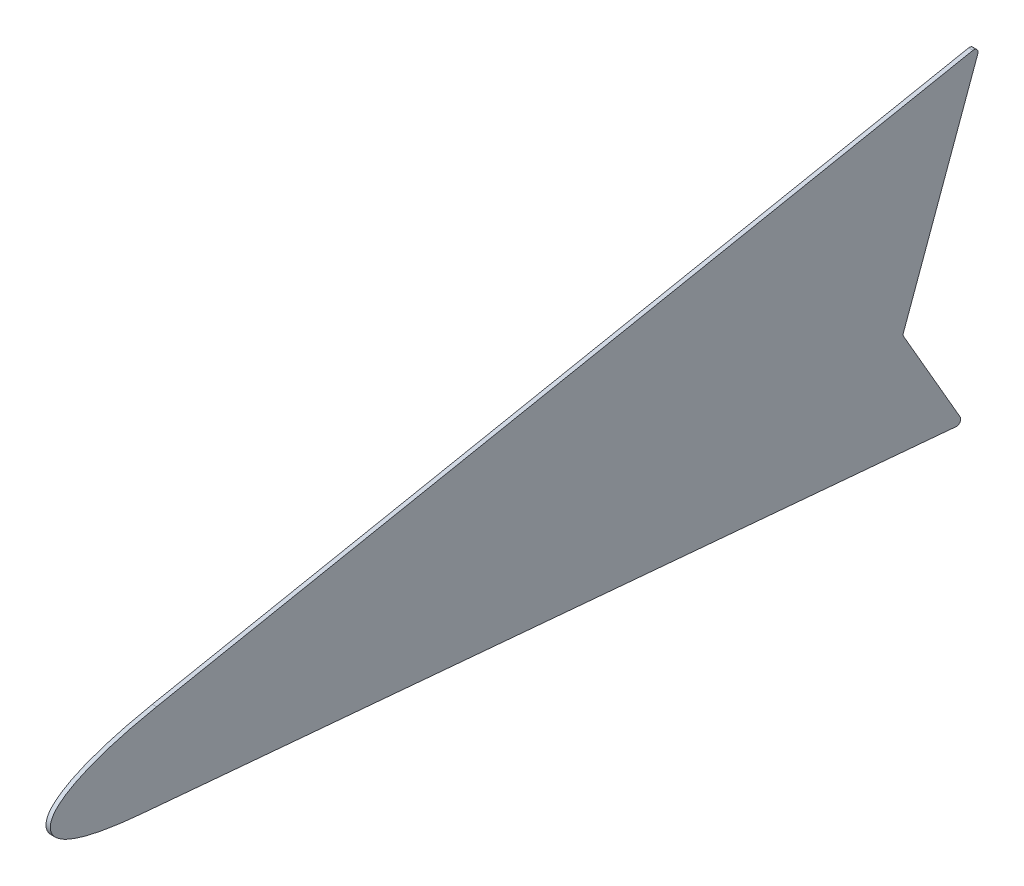
ISO-10303-21;
HEADER;
FILE_DESCRIPTION(('STEP AP214'),'2;1');
FILE_NAME('part.step','',(''),(''),'','','');
FILE_SCHEMA(('AUTOMOTIVE_DESIGN { 1 0 10303 214 1 1 1 1 }'));
ENDSEC;
DATA;
#1=APPLICATION_CONTEXT('core data for automotive mechanical design processes');
#2=APPLICATION_PROTOCOL_DEFINITION('international standard','automotive_design',2000,#1);
#3=PRODUCT_CONTEXT('',#1,'mechanical');
#4=PRODUCT('Part','Part','',(#3));
#5=PRODUCT_RELATED_PRODUCT_CATEGORY('part','',(#4));
#6=PRODUCT_DEFINITION_FORMATION('','',#4);
#7=PRODUCT_DEFINITION_CONTEXT('part definition',#1,'design');
#8=PRODUCT_DEFINITION('design','',#6,#7);
#9=PRODUCT_DEFINITION_SHAPE('','',#8);
#10=(LENGTH_UNIT() NAMED_UNIT(*) SI_UNIT(.MILLI.,.METRE.));
#11=(NAMED_UNIT(*) PLANE_ANGLE_UNIT() SI_UNIT($,.RADIAN.));
#12=(NAMED_UNIT(*) SI_UNIT($,.STERADIAN.) SOLID_ANGLE_UNIT());
#13=UNCERTAINTY_MEASURE_WITH_UNIT(LENGTH_MEASURE(1.E-05),#10,'distance_accuracy_value','');
#14=(GEOMETRIC_REPRESENTATION_CONTEXT(3) GLOBAL_UNCERTAINTY_ASSIGNED_CONTEXT((#13)) GLOBAL_UNIT_ASSIGNED_CONTEXT((#10,
#11,#12)) REPRESENTATION_CONTEXT('',''));
#15=CARTESIAN_POINT('',(0.,0.,0.));
#16=DIRECTION('',(0.,0.,1.));
#17=DIRECTION('',(1.,0.,0.));
#18=AXIS2_PLACEMENT_3D('',#15,#16,#17);
#19=CARTESIAN_POINT('',(2.,0.,-400.));
#20=CARTESIAN_POINT('',(2.,0.0197947129168696,-400.001279740819));
#21=CARTESIAN_POINT('',(2.,0.156332527137393,-399.125755392038));
#22=CARTESIAN_POINT('',(2.,0.393382640647567,-398.229457276693));
#23=CARTESIAN_POINT('',(2.,0.829825186715881,-396.022017359462));
#24=CARTESIAN_POINT('',(2.,1.41285046403746,-393.278844343855));
#25=CARTESIAN_POINT('',(2.,2.15806264658598,-389.636096258546));
#26=CARTESIAN_POINT('',(2.,3.04633621741629,-385.26126028557));
#27=CARTESIAN_POINT('',(2.,4.07101521641602,-380.11450057359));
#28=CARTESIAN_POINT('',(2.,5.21845014752439,-374.235554989704));
#29=CARTESIAN_POINT('',(2.,6.47588854331504,-367.640871489683));
#30=CARTESIAN_POINT('',(2.,7.82896610656693,-360.358344019565));
#31=CARTESIAN_POINT('',(2.,9.26211326073045,-352.415962034534));
#32=CARTESIAN_POINT('',(2.,10.7617204287628,-343.84576304999));
#33=CARTESIAN_POINT('',(2.,12.3093900978254,-334.681319033717));
#34=CARTESIAN_POINT('',(2.,13.8923181987624,-324.959756502571));
#35=CARTESIAN_POINT('',(2.,15.4920665589494,-314.719411881119));
#36=CARTESIAN_POINT('',(2.,17.0949943472313,-304.002041698686));
#37=CARTESIAN_POINT('',(2.,18.6830735471429,-292.850622554109));
#38=CARTESIAN_POINT('',(2.,20.2429413774078,-281.310854388592));
#39=CARTESIAN_POINT('',(2.,21.757434649034,-269.429406110183));
#40=CARTESIAN_POINT('',(2.,23.2131814732132,-257.254945982873));
#41=CARTESIAN_POINT('',(2.,24.5932386059916,-244.837355317981));
#42=CARTESIAN_POINT('',(2.,25.8853586046403,-232.227860986267));
#43=CARTESIAN_POINT('',(2.,27.0727890487436,-219.47859088263));
#44=CARTESIAN_POINT('',(2.,28.1440143029068,-206.642452070231));
#45=CARTESIAN_POINT('',(2.,29.0838708339412,-193.772737074317));
#46=CARTESIAN_POINT('',(2.,29.8810597647019,-180.923115762722));
#47=CARTESIAN_POINT('',(2.,30.5231575214927,-168.135515730387));
#48=CARTESIAN_POINT('',(2.,31.0074692117424,-155.442056785022));
#49=CARTESIAN_POINT('',(2.,31.2633627796288,-142.89430668028));
#50=CARTESIAN_POINT('',(2.,31.285978209756,-130.559397193334));
#51=CARTESIAN_POINT('',(2.,31.0738400012975,-118.51284837154));
#52=CARTESIAN_POINT('',(2.,30.627749201524,-106.807852799432));
#53=CARTESIAN_POINT('',(2.,29.9511551801664,-95.4960260814104));
#54=CARTESIAN_POINT('',(2.,29.0516922510891,-84.627170622608));
#55=CARTESIAN_POINT('',(2.,27.9389758199482,-74.2489762635761));
#56=CARTESIAN_POINT('',(2.,26.6254718148516,-64.4067193232036));
#57=CARTESIAN_POINT('',(2.,25.1266591699938,-55.1428756137543));
#58=CARTESIAN_POINT('',(2.,23.459629101011,-46.4971036079525));
#59=CARTESIAN_POINT('',(2.,21.6429047407353,-38.50579772216));
#60=CARTESIAN_POINT('',(2.,19.6983176474782,-31.2014663634208));
#61=CARTESIAN_POINT('',(2.,17.6459947650302,-24.6136995122795));
#62=CARTESIAN_POINT('',(2.,15.5081505371571,-18.7672416395236));
#63=CARTESIAN_POINT('',(2.,13.3047006786554,-13.6835504005457));
#64=CARTESIAN_POINT('',(2.,11.0558168216952,-9.37800281993501));
#65=CARTESIAN_POINT('',(2.,8.77722888373101,-5.86129791716867));
#66=CARTESIAN_POINT('',(2.,6.47719945193535,-3.13832299701485));
#67=CARTESIAN_POINT('',(2.,4.15223168769162,-1.21012998654755));
#68=CARTESIAN_POINT('',(2.,1.77293844222192,-0.0978117570210915));
#69=CARTESIAN_POINT('',(2.,-0.636761689370791,0.114930504650288));
#70=CARTESIAN_POINT('',(2.,-2.95314326207808,-0.577664339869116));
#71=CARTESIAN_POINT('',(2.,-5.06106832091674,-2.13584835524254));
#72=CARTESIAN_POINT('',(2.,-6.95971381874842,-4.46944507192717));
#73=CARTESIAN_POINT('',(2.,-8.6867559259926,-7.56004092316311));
#74=CARTESIAN_POINT('',(2.,-10.2560623998425,-11.4019440674076));
#75=CARTESIAN_POINT('',(2.,-11.6711394018962,-15.9860321124689));
#76=CARTESIAN_POINT('',(2.,-12.9302584233227,-21.29697145114));
#77=CARTESIAN_POINT('',(2.,-14.0326276613934,-27.3142769348645));
#78=CARTESIAN_POINT('',(2.,-14.9762511589987,-34.0140341239877));
#79=CARTESIAN_POINT('',(2.,-15.7633313970272,-41.3686012689998));
#80=CARTESIAN_POINT('',(2.,-16.3932440315434,-49.3487634440007));
#81=CARTESIAN_POINT('',(2.,-16.8720198371499,-57.9222696969542));
#82=CARTESIAN_POINT('',(2.,-17.2029368860178,-67.0555379420581));
#83=CARTESIAN_POINT('',(2.,-17.3943932629078,-76.7129338688125));
#84=CARTESIAN_POINT('',(2.,-17.4542992160825,-86.8570209128186));
#85=CARTESIAN_POINT('',(2.,-17.3945996061524,-97.4490934261169));
#86=CARTESIAN_POINT('',(2.,-17.2262929887119,-108.448584203136));
#87=CARTESIAN_POINT('',(2.,-16.9625043068118,-119.813954734919));
#88=CARTESIAN_POINT('',(2.,-16.6186558833316,-131.501979375258));
#89=CARTESIAN_POINT('',(2.,-16.2084429411847,-143.468294931642));
#90=CARTESIAN_POINT('',(2.,-15.7469400754044,-155.688824280291));
#91=CARTESIAN_POINT('',(2.,-15.2497610206306,-168.128434028804));
#92=CARTESIAN_POINT('',(2.,-14.6691266753124,-180.735619486172));
#93=CARTESIAN_POINT('',(2.,-14.0250470986317,-193.438321948107));
#94=CARTESIAN_POINT('',(2.,-13.3295952782398,-206.173468480363));
#95=CARTESIAN_POINT('',(2.,-12.593926451913,-218.88946064599));
#96=CARTESIAN_POINT('',(2.,-11.82935805124,-231.534918207502));
#97=CARTESIAN_POINT('',(2.,-11.0443185590819,-244.058176462787));
#98=CARTESIAN_POINT('',(2.,-10.2493391434955,-256.40829648734));
#99=CARTESIAN_POINT('',(2.,-9.45156771535331,-268.534442570928));
#100=CARTESIAN_POINT('',(2.,-8.65797581301992,-280.386904846025));
#101=CARTESIAN_POINT('',(2.,-7.8744821114451,-291.916612523528));
#102=CARTESIAN_POINT('',(2.,-7.10704796262947,-303.075883872231));
#103=CARTESIAN_POINT('',(2.,-6.35970304914345,-313.818139647621));
#104=CARTESIAN_POINT('',(2.,-5.63722878534559,-324.098630784116));
#105=CARTESIAN_POINT('',(2.,-4.94327642531218,-333.874155684626));
#106=CARTESIAN_POINT('',(2.,-4.28056144658677,-343.103593810719));
#107=CARTESIAN_POINT('',(2.,-3.65384008946951,-351.747956433842));
#108=CARTESIAN_POINT('',(2.,-3.06594327333352,-359.770598015047));
#109=CARTESIAN_POINT('',(2.,-2.52021412782374,-367.137192908518));
#110=CARTESIAN_POINT('',(2.,-2.01979637012181,-373.816934016911));
#111=CARTESIAN_POINT('',(2.,-1.56843461662025,-379.779057308665));
#112=CARTESIAN_POINT('',(2.,-1.1694943704302,-385.004444182564));
#113=CARTESIAN_POINT('',(2.,-0.825264554324244,-389.450573968433));
#114=CARTESIAN_POINT('',(2.,-0.541831640047924,-393.155293389024));
#115=CARTESIAN_POINT('',(2.,-0.310810179319602,-395.949030842327));
#116=CARTESIAN_POINT('',(2.,-0.161082139924569,-398.193673160703));
#117=CARTESIAN_POINT('',(2.,-0.0415201994549506,-399.113015792472));
#118=CARTESIAN_POINT('',(2.,-0.0197982912369602,-399.99872002784));
#119=CARTESIAN_POINT('',(2.,0.,-400.));
#120=B_SPLINE_CURVE_WITH_KNOTS('',3,(#19,#20,#21,#22,#23,#24,#25,#26,#27,#28,#29,#30,#31,#32,
#33,#34,#35,#36,#37,#38,#39,#40,#41,#42,#43,#44,#45,#46,#47,#48,#49,#50,#51,#52,#53,#54,#55,#56,
#57,#58,#59,#60,#61,#62,#63,#64,#65,#66,#67,#68,#69,#70,#71,#72,#73,#74,#75,#76,#77,#78,#79,#80,
#81,#82,#83,#84,#85,#86,#87,#88,#89,#90,#91,#92,#93,#94,#95,#96,#97,#98,#99,#100,#101,#102,#103,
#104,#105,#106,#107,#108,#109,#110,#111,#112,#113,#114,#115,#116,#117,#118,#119),.UNSPECIFIED.,
.T.,.F.,(4,1,1,1,1,1,1,1,1,1,1,1,1,1,1,1,1,1,1,1,1,1,1,1,1,1,1,1,1,1,1,1,1,1,1,1,1,1,1,1,1,1,1,
1,1,1,1,1,1,1,1,1,1,1,1,1,1,1,1,1,1,1,1,1,1,1,1,1,1,1,1,1,1,1,1,1,1,1,1,1,1,1,1,1,1,1,1,1,1,1,1,
1,1,1,1,1,1,1,4),(0.,0.000509380845012488,0.00203646307590124,0.00457341926629267,
0.0081105145788543,0.0126329096148001,0.0181209836253684,0.0245525666897466,0.0318997827868983,
0.0401327208195902,0.0492169538926517,0.0591146106234487,0.0697846469598171,0.0811828204928815,
0.093262058015785,0.105972599321169,0.119262722082758,0.133076198552495,0.147356830406351,
0.162045952365196,0.177082357202397,0.192404911433952,0.207949512805986,0.223652623225201,
0.239448770732334,0.255273659445434,0.271062013813257,0.286748998460011,0.302314538635537,
0.317730991933122,0.332857313309961,0.347631370311637,0.361994884224481,0.375890433346041,
0.389262766611196,0.402060741464395,0.414235274400511,0.425740249634603,0.436534667690425,
0.44658026405841,0.455844073318529,0.464299075737223,0.471923139377412,0.478704818330874,
0.484641939507213,0.489750398382793,0.49407133019376,0.497690549223108,0.500769140893951,
0.503574039001313,0.506378403433147,0.509454074703249,0.513061791383556,0.517355790229092,
0.522417511888073,0.528283213816907,0.534965478772509,0.542459995104075,0.550751382375855,
0.559818254563727,0.569631416818408,0.580159206451264,0.591364742786932,0.603207990153797,
0.615646879320324,0.628634573778994,0.642124006572728,0.656064092669976,0.670402751194665,
0.685085102221196,0.70005497449661,0.715333927532613,0.730825550855942,0.746423602741533,
0.7620644973333,0.77768509909477,0.793221223582033,0.808609709294583,0.823786827886597,
0.83869043554114,0.853258431078044,0.867431208122838,0.881149184071695,0.894355313168835,
0.906994501715906,0.919013675859722,0.930361749946572,0.94099147817621,0.950857148257383,
0.959916467609207,0.968131539835627,0.975466385138065,0.981888965553268,0.987372125664153,
0.991891224075229,0.995426990907306,0.997964024036548,0.999490527073444,1.),.UNSPECIFIED.);
#121=DIRECTION('',(-1.,0.,0.));
#122=VECTOR('',#121,1.);
#123=SURFACE_OF_LINEAR_EXTRUSION('',#120,#122);
#124=CARTESIAN_POINT('',(0.,0.,-400.));
#125=CARTESIAN_POINT('',(0.,0.0197947129168696,-400.001279740819));
#126=CARTESIAN_POINT('',(0.,0.156332527137393,-399.125755392038));
#127=CARTESIAN_POINT('',(0.,0.393382640647567,-398.229457276693));
#128=CARTESIAN_POINT('',(0.,0.829825186715881,-396.022017359462));
#129=CARTESIAN_POINT('',(0.,1.41285046403746,-393.278844343855));
#130=CARTESIAN_POINT('',(0.,2.15806264658598,-389.636096258546));
#131=CARTESIAN_POINT('',(0.,3.04633621741629,-385.26126028557));
#132=CARTESIAN_POINT('',(0.,4.07101521641602,-380.11450057359));
#133=CARTESIAN_POINT('',(0.,5.21845014752439,-374.235554989704));
#134=CARTESIAN_POINT('',(0.,6.47588854331504,-367.640871489683));
#135=CARTESIAN_POINT('',(0.,7.82896610656693,-360.358344019565));
#136=CARTESIAN_POINT('',(0.,9.26211326073045,-352.415962034534));
#137=CARTESIAN_POINT('',(0.,10.7617204287628,-343.84576304999));
#138=CARTESIAN_POINT('',(0.,12.3093900978254,-334.681319033717));
#139=CARTESIAN_POINT('',(0.,13.8923181987624,-324.959756502571));
#140=CARTESIAN_POINT('',(0.,15.4920665589494,-314.719411881119));
#141=CARTESIAN_POINT('',(0.,17.0949943472313,-304.002041698686));
#142=CARTESIAN_POINT('',(0.,18.6830735471429,-292.850622554109));
#143=CARTESIAN_POINT('',(0.,20.2429413774078,-281.310854388592));
#144=CARTESIAN_POINT('',(0.,21.757434649034,-269.429406110183));
#145=CARTESIAN_POINT('',(0.,23.2131814732132,-257.254945982873));
#146=CARTESIAN_POINT('',(0.,24.5932386059916,-244.837355317981));
#147=CARTESIAN_POINT('',(0.,25.8853586046403,-232.227860986267));
#148=CARTESIAN_POINT('',(0.,27.0727890487436,-219.47859088263));
#149=CARTESIAN_POINT('',(0.,28.1440143029068,-206.642452070231));
#150=CARTESIAN_POINT('',(0.,29.0838708339412,-193.772737074317));
#151=CARTESIAN_POINT('',(0.,29.8810597647019,-180.923115762722));
#152=CARTESIAN_POINT('',(0.,30.5231575214927,-168.135515730387));
#153=CARTESIAN_POINT('',(0.,31.0074692117424,-155.442056785022));
#154=CARTESIAN_POINT('',(0.,31.2633627796288,-142.89430668028));
#155=CARTESIAN_POINT('',(0.,31.285978209756,-130.559397193334));
#156=CARTESIAN_POINT('',(0.,31.0738400012975,-118.51284837154));
#157=CARTESIAN_POINT('',(0.,30.627749201524,-106.807852799432));
#158=CARTESIAN_POINT('',(0.,29.9511551801664,-95.4960260814104));
#159=CARTESIAN_POINT('',(0.,29.0516922510891,-84.627170622608));
#160=CARTESIAN_POINT('',(0.,27.9389758199482,-74.2489762635761));
#161=CARTESIAN_POINT('',(0.,26.6254718148516,-64.4067193232036));
#162=CARTESIAN_POINT('',(0.,25.1266591699938,-55.1428756137543));
#163=CARTESIAN_POINT('',(0.,23.459629101011,-46.4971036079525));
#164=CARTESIAN_POINT('',(0.,21.6429047407353,-38.50579772216));
#165=CARTESIAN_POINT('',(0.,19.6983176474782,-31.2014663634208));
#166=CARTESIAN_POINT('',(0.,17.6459947650302,-24.6136995122795));
#167=CARTESIAN_POINT('',(0.,15.5081505371571,-18.7672416395236));
#168=CARTESIAN_POINT('',(0.,13.3047006786554,-13.6835504005457));
#169=CARTESIAN_POINT('',(0.,11.0558168216952,-9.37800281993501));
#170=CARTESIAN_POINT('',(0.,8.77722888373101,-5.86129791716867));
#171=CARTESIAN_POINT('',(0.,6.47719945193535,-3.13832299701485));
#172=CARTESIAN_POINT('',(0.,4.15223168769162,-1.21012998654755));
#173=CARTESIAN_POINT('',(0.,1.77293844222192,-0.0978117570210915));
#174=CARTESIAN_POINT('',(0.,-0.636761689370791,0.114930504650288));
#175=CARTESIAN_POINT('',(0.,-2.95314326207808,-0.577664339869116));
#176=CARTESIAN_POINT('',(0.,-5.06106832091674,-2.13584835524254));
#177=CARTESIAN_POINT('',(0.,-6.95971381874842,-4.46944507192717));
#178=CARTESIAN_POINT('',(0.,-8.6867559259926,-7.56004092316311));
#179=CARTESIAN_POINT('',(0.,-10.2560623998425,-11.4019440674076));
#180=CARTESIAN_POINT('',(0.,-11.6711394018962,-15.9860321124689));
#181=CARTESIAN_POINT('',(0.,-12.9302584233227,-21.29697145114));
#182=CARTESIAN_POINT('',(0.,-14.0326276613934,-27.3142769348645));
#183=CARTESIAN_POINT('',(0.,-14.9762511589987,-34.0140341239877));
#184=CARTESIAN_POINT('',(0.,-15.7633313970272,-41.3686012689998));
#185=CARTESIAN_POINT('',(0.,-16.3932440315434,-49.3487634440007));
#186=CARTESIAN_POINT('',(0.,-16.8720198371499,-57.9222696969542));
#187=CARTESIAN_POINT('',(0.,-17.2029368860178,-67.0555379420581));
#188=CARTESIAN_POINT('',(0.,-17.3943932629078,-76.7129338688125));
#189=CARTESIAN_POINT('',(0.,-17.4542992160825,-86.8570209128186));
#190=CARTESIAN_POINT('',(0.,-17.3945996061524,-97.4490934261169));
#191=CARTESIAN_POINT('',(0.,-17.2262929887119,-108.448584203136));
#192=CARTESIAN_POINT('',(0.,-16.9625043068118,-119.813954734919));
#193=CARTESIAN_POINT('',(0.,-16.6186558833316,-131.501979375258));
#194=CARTESIAN_POINT('',(0.,-16.2084429411847,-143.468294931642));
#195=CARTESIAN_POINT('',(0.,-15.7469400754044,-155.688824280291));
#196=CARTESIAN_POINT('',(0.,-15.2497610206306,-168.128434028804));
#197=CARTESIAN_POINT('',(0.,-14.6691266753124,-180.735619486172));
#198=CARTESIAN_POINT('',(0.,-14.0250470986317,-193.438321948107));
#199=CARTESIAN_POINT('',(0.,-13.3295952782398,-206.173468480363));
#200=CARTESIAN_POINT('',(0.,-12.593926451913,-218.88946064599));
#201=CARTESIAN_POINT('',(0.,-11.82935805124,-231.534918207502));
#202=CARTESIAN_POINT('',(0.,-11.0443185590819,-244.058176462787));
#203=CARTESIAN_POINT('',(0.,-10.2493391434955,-256.40829648734));
#204=CARTESIAN_POINT('',(0.,-9.45156771535331,-268.534442570928));
#205=CARTESIAN_POINT('',(0.,-8.65797581301992,-280.386904846025));
#206=CARTESIAN_POINT('',(0.,-7.8744821114451,-291.916612523528));
#207=CARTESIAN_POINT('',(0.,-7.10704796262947,-303.075883872231));
#208=CARTESIAN_POINT('',(0.,-6.35970304914345,-313.818139647621));
#209=CARTESIAN_POINT('',(0.,-5.63722878534559,-324.098630784116));
#210=CARTESIAN_POINT('',(0.,-4.94327642531218,-333.874155684626));
#211=CARTESIAN_POINT('',(0.,-4.28056144658677,-343.103593810719));
#212=CARTESIAN_POINT('',(0.,-3.65384008946951,-351.747956433842));
#213=CARTESIAN_POINT('',(0.,-3.06594327333352,-359.770598015047));
#214=CARTESIAN_POINT('',(0.,-2.52021412782374,-367.137192908518));
#215=CARTESIAN_POINT('',(0.,-2.01979637012181,-373.816934016911));
#216=CARTESIAN_POINT('',(0.,-1.56843461662025,-379.779057308665));
#217=CARTESIAN_POINT('',(0.,-1.1694943704302,-385.004444182564));
#218=CARTESIAN_POINT('',(0.,-0.825264554324244,-389.450573968433));
#219=CARTESIAN_POINT('',(0.,-0.541831640047924,-393.155293389024));
#220=CARTESIAN_POINT('',(0.,-0.310810179319602,-395.949030842327));
#221=CARTESIAN_POINT('',(0.,-0.161082139924569,-398.193673160703));
#222=CARTESIAN_POINT('',(0.,-0.0415201994549506,-399.113015792472));
#223=CARTESIAN_POINT('',(0.,-0.0197982912369602,-399.99872002784));
#224=CARTESIAN_POINT('',(0.,0.,-400.));
#225=B_SPLINE_CURVE_WITH_KNOTS('',3,(#124,#125,#126,#127,#128,#129,#130,#131,#132,#133,#134,
#135,#136,#137,#138,#139,#140,#141,#142,#143,#144,#145,#146,#147,#148,#149,#150,#151,#152,#153,
#154,#155,#156,#157,#158,#159,#160,#161,#162,#163,#164,#165,#166,#167,#168,#169,#170,#171,#172,
#173,#174,#175,#176,#177,#178,#179,#180,#181,#182,#183,#184,#185,#186,#187,#188,#189,#190,#191,
#192,#193,#194,#195,#196,#197,#198,#199,#200,#201,#202,#203,#204,#205,#206,#207,#208,#209,#210,
#211,#212,#213,#214,#215,#216,#217,#218,#219,#220,#221,#222,#223,#224),.UNSPECIFIED.,.T.,.F.,(4,
1,1,1,1,1,1,1,1,1,1,1,1,1,1,1,1,1,1,1,1,1,1,1,1,1,1,1,1,1,1,1,1,1,1,1,1,1,1,1,1,1,1,1,1,1,1,1,1,
1,1,1,1,1,1,1,1,1,1,1,1,1,1,1,1,1,1,1,1,1,1,1,1,1,1,1,1,1,1,1,1,1,1,1,1,1,1,1,1,1,1,1,1,1,1,1,1,
1,4),(0.,0.000509380845012488,0.00203646307590124,0.00457341926629267,0.0081105145788543,
0.0126329096148001,0.0181209836253684,0.0245525666897466,0.0318997827868983,0.0401327208195902,
0.0492169538926517,0.0591146106234487,0.0697846469598171,0.0811828204928815,0.093262058015785,
0.105972599321169,0.119262722082758,0.133076198552495,0.147356830406351,0.162045952365196,
0.177082357202397,0.192404911433952,0.207949512805986,0.223652623225201,0.239448770732334,
0.255273659445434,0.271062013813257,0.286748998460011,0.302314538635537,0.317730991933122,
0.332857313309961,0.347631370311637,0.361994884224481,0.375890433346041,0.389262766611196,
0.402060741464395,0.414235274400511,0.425740249634603,0.436534667690425,0.44658026405841,
0.455844073318529,0.464299075737223,0.471923139377412,0.478704818330874,0.484641939507213,
0.489750398382793,0.49407133019376,0.497690549223108,0.500769140893951,0.503574039001313,
0.506378403433147,0.509454074703249,0.513061791383556,0.517355790229092,0.522417511888073,
0.528283213816907,0.534965478772509,0.542459995104075,0.550751382375855,0.559818254563727,
0.569631416818408,0.580159206451264,0.591364742786932,0.603207990153797,0.615646879320324,
0.628634573778994,0.642124006572728,0.656064092669976,0.670402751194665,0.685085102221196,
0.70005497449661,0.715333927532613,0.730825550855942,0.746423602741533,0.7620644973333,
0.77768509909477,0.793221223582033,0.808609709294583,0.823786827886597,0.83869043554114,
0.853258431078044,0.867431208122838,0.881149184071695,0.894355313168835,0.906994501715906,
0.919013675859722,0.930361749946572,0.94099147817621,0.950857148257383,0.959916467609207,
0.968131539835627,0.975466385138065,0.981888965553268,0.987372125664153,0.991891224075229,
0.995426990907306,0.997964024036548,0.999490527073444,1.),.UNSPECIFIED.);
#226=CARTESIAN_POINT('',(0.,24.0968066538449,-49.8714391729704));
#227=VERTEX_POINT('',#226);
#228=CARTESIAN_POINT('',(0.,-15.8377600076667,-42.5868399173375));
#229=VERTEX_POINT('',#228);
#230=EDGE_CURVE('E122',#227,#229,#225,.T.);
#231=ORIENTED_EDGE('',*,*,#230,.T.);
#232=DIRECTION('',(-1.,0.,0.));
#233=VECTOR('',#232,1.);
#234=CARTESIAN_POINT('',(2.,-15.8377600076667,-42.5868399173375));
#235=LINE('',#234,#233);
#236=CARTESIAN_POINT('',(2.,-15.8377600076667,-42.5868399173375));
#237=VERTEX_POINT('',#236);
#238=EDGE_CURVE('E107',#237,#229,#235,.T.);
#239=ORIENTED_EDGE('',*,*,#238,.F.);
#240=CARTESIAN_POINT('',(2.,24.0968066538449,-49.8714391729704));
#241=VERTEX_POINT('',#240);
#242=EDGE_CURVE('E111',#241,#237,#120,.T.);
#243=ORIENTED_EDGE('',*,*,#242,.F.);
#244=DIRECTION('',(-1.,0.,0.));
#245=VECTOR('',#244,1.);
#246=CARTESIAN_POINT('',(2.,24.0968066538449,-49.8714391729704));
#247=LINE('',#246,#245);
#248=EDGE_CURVE('E124',#241,#227,#247,.T.);
#249=ORIENTED_EDGE('',*,*,#248,.T.);
#250=EDGE_LOOP('',(#231,#239,#243,#249));
#251=FACE_BOUND('',#250,.T.);
#252=ADVANCED_FACE('F39',(#251),#123,.F.);
#253=CARTESIAN_POINT('',(2.,-15.8377600076667,-42.5868399173375));
#254=DIRECTION('',(0.,0.996112072083883,-0.0880950614322601));
#255=DIRECTION('',(0.,0.0880950614322601,0.996112072083883));
#256=AXIS2_PLACEMENT_3D('',#253,#254,#255);
#257=PLANE('',#256);
#258=DIRECTION('',(0.,-0.0880950614322601,-0.996112072083883));
#259=VECTOR('',#258,1.);
#260=CARTESIAN_POINT('',(0.,-15.8377600076667,-42.5868399173375));
#261=LINE('',#260,#259);
#262=CARTESIAN_POINT('',(0.,-49.6611519625234,-425.036077108286));
#263=VERTEX_POINT('',#262);
#264=EDGE_CURVE('E164',#229,#263,#261,.T.);
#265=ORIENTED_EDGE('',*,*,#264,.T.);
#266=DIRECTION('',(-1.,0.,0.));
#267=VECTOR('',#266,1.);
#268=CARTESIAN_POINT('',(2.,-49.6611519625234,-425.036077108286));
#269=LINE('',#268,#267);
#270=CARTESIAN_POINT('',(2.,-49.6611519625234,-425.036077108286));
#271=VERTEX_POINT('',#270);
#272=EDGE_CURVE('E62',#263,#271,#269,.F.);
#273=ORIENTED_EDGE('',*,*,#272,.T.);
#274=DIRECTION('',(0.,-0.0880950614322601,-0.996112072083883));
#275=VECTOR('',#274,1.);
#276=CARTESIAN_POINT('',(2.,-15.8377600076667,-42.5868399173375));
#277=LINE('',#276,#275);
#278=EDGE_CURVE('E103',#237,#271,#277,.T.);
#279=ORIENTED_EDGE('',*,*,#278,.F.);
#280=ORIENTED_EDGE('',*,*,#238,.T.);
#281=EDGE_LOOP('',(#265,#273,#279,#280));
#282=FACE_BOUND('',#281,.T.);
#283=ADVANCED_FACE('F105',(#282),#257,.F.);
#284=CARTESIAN_POINT('',(2.,-50.,-428.867513459482));
#285=DIRECTION('',(0.,-0.500000000000004,0.866025403784436));
#286=DIRECTION('',(0.,-0.866025403784437,-0.500000000000004));
#287=AXIS2_PLACEMENT_3D('',#284,#285,#286);
#288=PLANE('',#287);
#289=DIRECTION('',(0.,0.866025403784436,0.500000000000004));
#290=VECTOR('',#289,1.);
#291=CARTESIAN_POINT('',(0.,-50.,-428.867513459482));
#292=LINE('',#291,#290);
#293=CARTESIAN_POINT('',(0.,-46.6689278183556,-426.944318038719));
#294=VERTEX_POINT('',#293);
#295=CARTESIAN_POINT('',(0.,-0.807668555882955,-400.466307658155));
#296=VERTEX_POINT('',#295);
#297=EDGE_CURVE('E153',#294,#296,#292,.T.);
#298=ORIENTED_EDGE('',*,*,#297,.T.);
#299=DIRECTION('',(-1.,0.,0.));
#300=VECTOR('',#299,1.);
#301=CARTESIAN_POINT('',(2.,-0.807668555882945,-400.466307658155));
#302=LINE('',#301,#300);
#303=CARTESIAN_POINT('',(2.,-0.807668555882955,-400.466307658155));
#304=VERTEX_POINT('',#303);
#305=EDGE_CURVE('E136',#296,#304,#302,.F.);
#306=ORIENTED_EDGE('',*,*,#305,.T.);
#307=DIRECTION('',(0.,0.866025403784436,0.500000000000004));
#308=VECTOR('',#307,1.);
#309=CARTESIAN_POINT('',(2.,-50.,-428.867513459482));
#310=LINE('',#309,#308);
#311=CARTESIAN_POINT('',(2.,-46.6689278183556,-426.944318038719));
#312=VERTEX_POINT('',#311);
#313=EDGE_CURVE('E110',#312,#304,#310,.T.);
#314=ORIENTED_EDGE('',*,*,#313,.F.);
#315=DIRECTION('',(-1.,0.,0.));
#316=VECTOR('',#315,1.);
#317=CARTESIAN_POINT('',(2.,-46.6689278183556,-426.944318038719));
#318=LINE('',#317,#316);
#319=EDGE_CURVE('E133',#312,#294,#318,.T.);
#320=ORIENTED_EDGE('',*,*,#319,.T.);
#321=EDGE_LOOP('',(#298,#306,#314,#320));
#322=FACE_BOUND('',#321,.T.);
#323=ADVANCED_FACE('F160',(#322),#288,.F.);
#324=CARTESIAN_POINT('',(2.,100.,-436.397023426621));
#325=DIRECTION('',(0.,0.342020143325673,0.939692620785907));
#326=DIRECTION('',(0.,-0.939692620785907,0.342020143325673));
#327=AXIS2_PLACEMENT_3D('',#324,#325,#326);
#328=PLANE('',#327);
#329=DIRECTION('',(0.,0.939692620785907,-0.342020143325673));
#330=VECTOR('',#329,1.);
#331=CARTESIAN_POINT('',(2.,100.,-436.397023426621));
#332=LINE('',#331,#330);
#333=CARTESIAN_POINT('',(2.,0.876371730768433,-400.318973224152));
#334=VERTEX_POINT('',#333);
#335=CARTESIAN_POINT('',(2.,96.6707467585685,-435.185274344405));
#336=VERTEX_POINT('',#335);
#337=EDGE_CURVE('E169',#334,#336,#332,.T.);
#338=ORIENTED_EDGE('',*,*,#337,.F.);
#339=DIRECTION('',(-1.,0.,0.));
#340=VECTOR('',#339,1.);
#341=CARTESIAN_POINT('',(0.,0.876371730768438,-400.318973224152));
#342=LINE('',#341,#340);
#343=CARTESIAN_POINT('',(0.,0.876371730768433,-400.318973224152));
#344=VERTEX_POINT('',#343);
#345=EDGE_CURVE('E126',#334,#344,#342,.T.);
#346=ORIENTED_EDGE('',*,*,#345,.T.);
#347=DIRECTION('',(0.,0.939692620785907,-0.342020143325673));
#348=VECTOR('',#347,1.);
#349=CARTESIAN_POINT('',(0.,100.,-436.397023426621));
#350=LINE('',#349,#348);
#351=CARTESIAN_POINT('',(0.,96.6707467585685,-435.185274344405));
#352=VERTEX_POINT('',#351);
#353=EDGE_CURVE('E155',#344,#352,#350,.T.);
#354=ORIENTED_EDGE('',*,*,#353,.T.);
#355=DIRECTION('',(-1.,0.,0.));
#356=VECTOR('',#355,1.);
#357=CARTESIAN_POINT('',(2.,96.6707467585685,-435.185274344405));
#358=LINE('',#357,#356);
#359=EDGE_CURVE('E123',#352,#336,#358,.F.);
#360=ORIENTED_EDGE('',*,*,#359,.T.);
#361=EDGE_LOOP('',(#338,#346,#354,#360));
#362=FACE_BOUND('',#361,.T.);
#363=ADVANCED_FACE('F171',(#362),#328,.F.);
#364=CARTESIAN_POINT('',(2.,24.0968066538449,-49.8714391729704));
#365=DIRECTION('',(0.,-0.981259130131038,-0.192692811320193));
#366=DIRECTION('',(0.,0.192692811320193,-0.981259130131038));
#367=AXIS2_PLACEMENT_3D('',#364,#365,#366);
#368=PLANE('',#367);
#369=DIRECTION('',(0.,-0.192692811320193,0.981259130131037));
#370=VECTOR('',#369,1.);
#371=CARTESIAN_POINT('',(2.,24.0968066538449,-49.8714391729704));
#372=LINE('',#371,#370);
#373=CARTESIAN_POINT('',(2.,99.317305305482,-432.920503480193));
#374=VERTEX_POINT('',#373);
#375=EDGE_CURVE('E115',#374,#241,#372,.T.);
#376=ORIENTED_EDGE('',*,*,#375,.F.);
#377=DIRECTION('',(-1.,0.,0.));
#378=VECTOR('',#377,1.);
#379=CARTESIAN_POINT('',(2.,99.317305305482,-432.920503480193));
#380=LINE('',#379,#378);
#381=CARTESIAN_POINT('',(0.,99.317305305482,-432.920503480193));
#382=VERTEX_POINT('',#381);
#383=EDGE_CURVE('E146',#374,#382,#380,.T.);
#384=ORIENTED_EDGE('',*,*,#383,.T.);
#385=DIRECTION('',(0.,-0.192692811320193,0.981259130131037));
#386=VECTOR('',#385,1.);
#387=CARTESIAN_POINT('',(0.,24.0968066538449,-49.8714391729704));
#388=LINE('',#387,#386);
#389=EDGE_CURVE('E119',#382,#227,#388,.T.);
#390=ORIENTED_EDGE('',*,*,#389,.T.);
#391=ORIENTED_EDGE('',*,*,#248,.F.);
#392=EDGE_LOOP('',(#376,#384,#390,#391));
#393=FACE_BOUND('',#392,.T.);
#394=ADVANCED_FACE('F186',(#393),#368,.F.);
#395=CARTESIAN_POINT('',(2.,2.26292544800455,-0.400092727756273));
#396=DIRECTION('',(-1.,0.,0.));
#397=DIRECTION('',(0.,0.,1.));
#398=AXIS2_PLACEMENT_3D('',#395,#396,#397);
#399=PLANE('',#398);
#400=ORIENTED_EDGE('',*,*,#278,.T.);
#401=CARTESIAN_POINT('',(2.,-47.6689278183556,-425.21226723115));
#402=DIRECTION('',(-1.,0.,0.));
#403=DIRECTION('',(0.,0.,1.));
#404=AXIS2_PLACEMENT_3D('',#401,#402,#403);
#405=CIRCLE('',#404,2.);
#406=EDGE_CURVE('E144',#271,#312,#405,.F.);
#407=ORIENTED_EDGE('',*,*,#406,.T.);
#408=ORIENTED_EDGE('',*,*,#313,.T.);
#409=CARTESIAN_POINT('',(2.,0.19233144411708,-402.198358465724));
#410=DIRECTION('',(-1.,0.,0.));
#411=DIRECTION('',(0.,0.,1.));
#412=AXIS2_PLACEMENT_3D('',#409,#410,#411);
#413=CIRCLE('',#412,2.);
#414=EDGE_CURVE('E11',#304,#334,#413,.T.);
#415=ORIENTED_EDGE('',*,*,#414,.T.);
#416=ORIENTED_EDGE('',*,*,#337,.T.);
#417=CARTESIAN_POINT('',(2.,97.3547870452199,-433.305889102834));
#418=DIRECTION('',(-1.,0.,0.));
#419=DIRECTION('',(0.,0.,1.));
#420=AXIS2_PLACEMENT_3D('',#417,#418,#419);
#421=CIRCLE('',#420,2.);
#422=EDGE_CURVE('E54',#336,#374,#421,.F.);
#423=ORIENTED_EDGE('',*,*,#422,.T.);
#424=ORIENTED_EDGE('',*,*,#375,.T.);
#425=ORIENTED_EDGE('',*,*,#242,.T.);
#426=EDGE_LOOP('',(#400,#407,#408,#415,#416,#423,#424,#425));
#427=FACE_BOUND('',#426,.T.);
#428=ADVANCED_FACE('F114',(#427),#399,.F.);
#429=CARTESIAN_POINT('',(0.,2.26292544800455,-0.400092727756273));
#430=DIRECTION('',(-1.,0.,0.));
#431=DIRECTION('',(0.,0.,1.));
#432=AXIS2_PLACEMENT_3D('',#429,#430,#431);
#433=PLANE('',#432);
#434=ORIENTED_EDGE('',*,*,#297,.F.);
#435=CARTESIAN_POINT('',(0.,-47.6689278183556,-425.21226723115));
#436=DIRECTION('',(-1.,0.,0.));
#437=DIRECTION('',(0.,0.,1.));
#438=AXIS2_PLACEMENT_3D('',#435,#436,#437);
#439=CIRCLE('',#438,2.);
#440=EDGE_CURVE('E140',#294,#263,#439,.T.);
#441=ORIENTED_EDGE('',*,*,#440,.T.);
#442=ORIENTED_EDGE('',*,*,#264,.F.);
#443=ORIENTED_EDGE('',*,*,#230,.F.);
#444=ORIENTED_EDGE('',*,*,#389,.F.);
#445=CARTESIAN_POINT('',(0.,97.3547870452199,-433.305889102834));
#446=DIRECTION('',(-1.,0.,0.));
#447=DIRECTION('',(0.,0.,1.));
#448=AXIS2_PLACEMENT_3D('',#445,#446,#447);
#449=CIRCLE('',#448,2.);
#450=EDGE_CURVE('E138',#382,#352,#449,.T.);
#451=ORIENTED_EDGE('',*,*,#450,.T.);
#452=ORIENTED_EDGE('',*,*,#353,.F.);
#453=CARTESIAN_POINT('',(0.,0.19233144411708,-402.198358465724));
#454=DIRECTION('',(-1.,0.,0.));
#455=DIRECTION('',(0.,0.,1.));
#456=AXIS2_PLACEMENT_3D('',#453,#454,#455);
#457=CIRCLE('',#456,2.);
#458=EDGE_CURVE('E47',#344,#296,#457,.F.);
#459=ORIENTED_EDGE('',*,*,#458,.T.);
#460=EDGE_LOOP('',(#434,#441,#442,#443,#444,#451,#452,#459));
#461=FACE_BOUND('',#460,.T.);
#462=ADVANCED_FACE('F152',(#461),#433,.T.);
#463=CARTESIAN_POINT('',(2.,0.19233144411708,-402.198358465724));
#464=DIRECTION('',(1.,0.,0.));
#465=DIRECTION('',(0.,0.,-1.));
#466=AXIS2_PLACEMENT_3D('',#463,#464,#465);
#467=CYLINDRICAL_SURFACE('',#466,2.);
#468=ORIENTED_EDGE('',*,*,#414,.F.);
#469=ORIENTED_EDGE('',*,*,#305,.F.);
#470=ORIENTED_EDGE('',*,*,#458,.F.);
#471=ORIENTED_EDGE('',*,*,#345,.F.);
#472=EDGE_LOOP('',(#468,#469,#470,#471));
#473=FACE_BOUND('',#472,.T.);
#474=ADVANCED_FACE('F167',(#473),#467,.F.);
#475=CARTESIAN_POINT('',(2.,-47.6689278183556,-425.21226723115));
#476=DIRECTION('',(-1.,0.,0.));
#477=DIRECTION('',(0.,0.,1.));
#478=AXIS2_PLACEMENT_3D('',#475,#476,#477);
#479=CYLINDRICAL_SURFACE('',#478,2.);
#480=ORIENTED_EDGE('',*,*,#406,.F.);
#481=ORIENTED_EDGE('',*,*,#272,.F.);
#482=ORIENTED_EDGE('',*,*,#440,.F.);
#483=ORIENTED_EDGE('',*,*,#319,.F.);
#484=EDGE_LOOP('',(#480,#481,#482,#483));
#485=FACE_BOUND('',#484,.T.);
#486=ADVANCED_FACE('F189',(#485),#479,.T.);
#487=CARTESIAN_POINT('',(2.,97.3547870452199,-433.305889102834));
#488=DIRECTION('',(-1.,0.,0.));
#489=DIRECTION('',(0.,0.,1.));
#490=AXIS2_PLACEMENT_3D('',#487,#488,#489);
#491=CYLINDRICAL_SURFACE('',#490,2.);
#492=ORIENTED_EDGE('',*,*,#422,.F.);
#493=ORIENTED_EDGE('',*,*,#359,.F.);
#494=ORIENTED_EDGE('',*,*,#450,.F.);
#495=ORIENTED_EDGE('',*,*,#383,.F.);
#496=EDGE_LOOP('',(#492,#493,#494,#495));
#497=FACE_BOUND('',#496,.T.);
#498=ADVANCED_FACE('F41',(#497),#491,.T.);
#499=CLOSED_SHELL('',(#252,#283,#323,#363,#394,#428,#462,#474,#486,#498));
#500=MANIFOLD_SOLID_BREP('B2',#499);
#501=ADVANCED_BREP_SHAPE_REPRESENTATION('',(#18,#500),#14);
#502=SHAPE_DEFINITION_REPRESENTATION(#9,#501);
ENDSEC;
END-ISO-10303-21;
